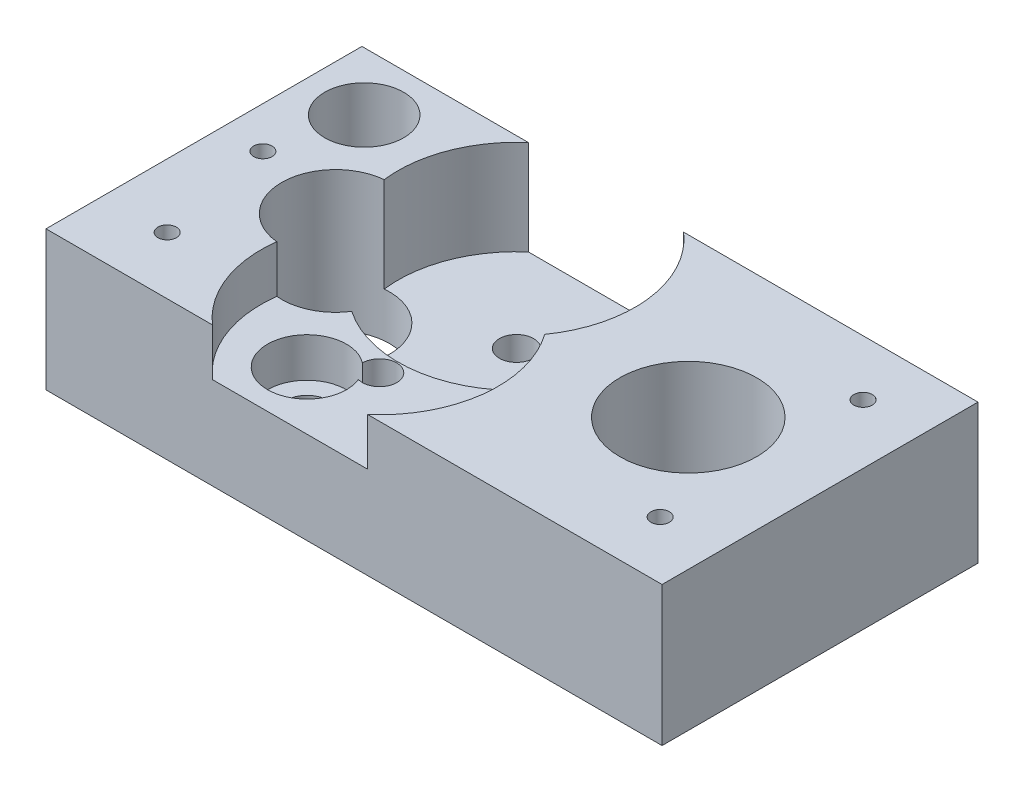
ISO-10303-21;
HEADER;
FILE_DESCRIPTION(('STEP AP214'),'2;1');
FILE_NAME('part.step','',(''),(''),'','','');
FILE_SCHEMA(('AUTOMOTIVE_DESIGN { 1 0 10303 214 1 1 1 1 }'));
ENDSEC;
DATA;
#1=APPLICATION_CONTEXT('core data for automotive mechanical design processes');
#2=APPLICATION_PROTOCOL_DEFINITION('international standard','automotive_design',2000,#1);
#3=PRODUCT_CONTEXT('',#1,'mechanical');
#4=PRODUCT('Part','Part','',(#3));
#5=PRODUCT_RELATED_PRODUCT_CATEGORY('part','',(#4));
#6=PRODUCT_DEFINITION_FORMATION('','',#4);
#7=PRODUCT_DEFINITION_CONTEXT('part definition',#1,'design');
#8=PRODUCT_DEFINITION('design','',#6,#7);
#9=PRODUCT_DEFINITION_SHAPE('','',#8);
#10=(LENGTH_UNIT() NAMED_UNIT(*) SI_UNIT(.MILLI.,.METRE.));
#11=(NAMED_UNIT(*) PLANE_ANGLE_UNIT() SI_UNIT($,.RADIAN.));
#12=(NAMED_UNIT(*) SI_UNIT($,.STERADIAN.) SOLID_ANGLE_UNIT());
#13=UNCERTAINTY_MEASURE_WITH_UNIT(LENGTH_MEASURE(1.E-05),#10,'distance_accuracy_value','');
#14=(GEOMETRIC_REPRESENTATION_CONTEXT(3) GLOBAL_UNCERTAINTY_ASSIGNED_CONTEXT((#13)) GLOBAL_UNIT_ASSIGNED_CONTEXT((#10,
#11,#12)) REPRESENTATION_CONTEXT('',''));
#15=CARTESIAN_POINT('',(0.,0.,0.));
#16=DIRECTION('',(0.,0.,1.));
#17=DIRECTION('',(1.,0.,0.));
#18=AXIS2_PLACEMENT_3D('',#15,#16,#17);
#19=CARTESIAN_POINT('',(2.3,0.,2.2141711607628));
#20=DIRECTION('',(0.,1.,0.));
#21=DIRECTION('',(0.,0.,1.));
#22=AXIS2_PLACEMENT_3D('',#19,#20,#21);
#23=CYLINDRICAL_SURFACE('',#22,0.8);
#24=CARTESIAN_POINT('',(2.3,0.,2.2141711607628));
#25=DIRECTION('',(0.,1.,0.));
#26=DIRECTION('',(0.,0.,1.));
#27=AXIS2_PLACEMENT_3D('',#24,#25,#26);
#28=CIRCLE('',#27,0.8);
#29=CARTESIAN_POINT('',(2.3,0.,3.0141711607628));
#30=VERTEX_POINT('',#29);
#31=EDGE_CURVE('E306',#30,#30,#28,.T.);
#32=ORIENTED_EDGE('',*,*,#31,.F.);
#33=EDGE_LOOP('',(#32));
#34=FACE_BOUND('',#33,.T.);
#35=CARTESIAN_POINT('',(2.3,2.,2.2141711607628));
#36=DIRECTION('',(0.,1.,0.));
#37=DIRECTION('',(0.,0.,1.));
#38=AXIS2_PLACEMENT_3D('',#35,#36,#37);
#39=CIRCLE('',#38,0.8);
#40=CARTESIAN_POINT('',(2.3,2.,3.0141711607628));
#41=VERTEX_POINT('',#40);
#42=EDGE_CURVE('E222',#41,#41,#39,.F.);
#43=ORIENTED_EDGE('',*,*,#42,.F.);
#44=EDGE_LOOP('',(#43));
#45=FACE_BOUND('',#44,.T.);
#46=ADVANCED_FACE('F117',(#34,#45),#23,.F.);
#47=CARTESIAN_POINT('',(7.7,0.,9.78582883923719));
#48=DIRECTION('',(0.,1.,0.));
#49=DIRECTION('',(0.,0.,1.));
#50=AXIS2_PLACEMENT_3D('',#47,#48,#49);
#51=CYLINDRICAL_SURFACE('',#50,0.800000000000001);
#52=CARTESIAN_POINT('',(7.7,0.,9.78582883923719));
#53=DIRECTION('',(0.,1.,0.));
#54=DIRECTION('',(0.,0.,1.));
#55=AXIS2_PLACEMENT_3D('',#52,#53,#54);
#56=CIRCLE('',#55,0.800000000000001);
#57=CARTESIAN_POINT('',(7.7,0.,10.5858288392372));
#58=VERTEX_POINT('',#57);
#59=EDGE_CURVE('E309',#58,#58,#56,.T.);
#60=ORIENTED_EDGE('',*,*,#59,.F.);
#61=EDGE_LOOP('',(#60));
#62=FACE_BOUND('',#61,.T.);
#63=CARTESIAN_POINT('',(7.7,2.,9.78582883923719));
#64=DIRECTION('',(0.,1.,0.));
#65=DIRECTION('',(0.,0.,1.));
#66=AXIS2_PLACEMENT_3D('',#63,#64,#65);
#67=CIRCLE('',#66,0.800000000000001);
#68=CARTESIAN_POINT('',(7.7,2.,10.5858288392372));
#69=VERTEX_POINT('',#68);
#70=EDGE_CURVE('E223',#69,#69,#67,.F.);
#71=ORIENTED_EDGE('',*,*,#70,.F.);
#72=EDGE_LOOP('',(#71));
#73=FACE_BOUND('',#72,.T.);
#74=ADVANCED_FACE('F429',(#62,#73),#51,.F.);
#75=CARTESIAN_POINT('',(0.,3.5,0.));
#76=DIRECTION('',(0.,1.,0.));
#77=DIRECTION('',(0.,0.,1.));
#78=AXIS2_PLACEMENT_3D('',#75,#76,#77);
#79=PLANE('',#78);
#80=CARTESIAN_POINT('',(7.7,3.5,9.78582883923719));
#81=DIRECTION('',(0.,1.,0.));
#82=DIRECTION('',(0.,0.,1.));
#83=AXIS2_PLACEMENT_3D('',#80,#81,#82);
#84=CIRCLE('',#83,1.5);
#85=CARTESIAN_POINT('',(8.62083363081924,3.5,8.601740403202));
#86=VERTEX_POINT('',#85);
#87=CARTESIAN_POINT('',(9.09107040473818,3.5,9.2246487174745));
#88=VERTEX_POINT('',#87);
#89=EDGE_CURVE('E303',#86,#88,#84,.T.);
#90=ORIENTED_EDGE('',*,*,#89,.F.);
#91=CARTESIAN_POINT('',(9.27083130081252,3.5,8.6));
#92=DIRECTION('',(0.,1.,0.));
#93=DIRECTION('',(0.,0.,1.));
#94=AXIS2_PLACEMENT_3D('',#91,#92,#93);
#95=CIRCLE('',#94,0.649999999999999);
#96=EDGE_CURVE('E234',#86,#88,#95,.F.);
#97=ORIENTED_EDGE('',*,*,#96,.T.);
#98=EDGE_LOOP('',(#90,#97));
#99=FACE_BOUND('',#98,.T.);
#100=CARTESIAN_POINT('',(9.27083130081252,3.5,8.6));
#101=DIRECTION('',(0.,1.,0.));
#102=DIRECTION('',(0.,0.,1.));
#103=AXIS2_PLACEMENT_3D('',#100,#101,#102);
#104=CIRCLE('',#103,4.5);
#105=CARTESIAN_POINT('',(12.2187118954093,3.5,12.));
#106=VERTEX_POINT('',#105);
#107=CARTESIAN_POINT('',(12.9437048352539,3.5,6.));
#108=VERTEX_POINT('',#107);
#109=EDGE_CURVE('E318',#106,#108,#104,.T.);
#110=ORIENTED_EDGE('',*,*,#109,.T.);
#111=CARTESIAN_POINT('',(9.27083130081252,3.5,3.4));
#112=DIRECTION('',(0.,1.,0.));
#113=DIRECTION('',(0.,0.,1.));
#114=AXIS2_PLACEMENT_3D('',#111,#112,#113);
#115=CIRCLE('',#114,4.5);
#116=CARTESIAN_POINT('',(6.72366983064256,3.5,7.10971271729788));
#117=VERTEX_POINT('',#116);
#118=EDGE_CURVE('E242',#117,#108,#115,.T.);
#119=ORIENTED_EDGE('',*,*,#118,.F.);
#120=CARTESIAN_POINT('',(5.,3.5,6.));
#121=DIRECTION('',(0.,1.,0.));
#122=DIRECTION('',(0.,0.,1.));
#123=AXIS2_PLACEMENT_3D('',#120,#121,#122);
#124=CIRCLE('',#123,2.05);
#125=CARTESIAN_POINT('',(4.8057148581784,3.5,8.04077271729788));
#126=VERTEX_POINT('',#125);
#127=EDGE_CURVE('E237',#117,#126,#124,.F.);
#128=ORIENTED_EDGE('',*,*,#127,.T.);
#129=CARTESIAN_POINT('',(9.27083130081252,3.5,8.6));
#130=DIRECTION('',(0.,1.,0.));
#131=DIRECTION('',(0.,0.,1.));
#132=AXIS2_PLACEMENT_3D('',#129,#130,#131);
#133=CIRCLE('',#132,4.5);
#134=CARTESIAN_POINT('',(6.32295070621578,3.5,12.));
#135=VERTEX_POINT('',#134);
#136=EDGE_CURVE('E339',#126,#135,#133,.T.);
#137=ORIENTED_EDGE('',*,*,#136,.T.);
#138=DIRECTION('',(1.,0.,0.));
#139=VECTOR('',#138,1.);
#140=CARTESIAN_POINT('',(0.,3.5,12.));
#141=LINE('',#140,#139);
#142=EDGE_CURVE('E251',#135,#106,#141,.T.);
#143=ORIENTED_EDGE('',*,*,#142,.T.);
#144=EDGE_LOOP('',(#110,#119,#128,#137,#143));
#145=FACE_BOUND('',#144,.T.);
#146=ADVANCED_FACE('F370',(#99,#145),#79,.T.);
#147=CARTESIAN_POINT('',(0.,1.7,0.));
#148=DIRECTION('',(0.,1.,0.));
#149=DIRECTION('',(0.,0.,1.));
#150=AXIS2_PLACEMENT_3D('',#147,#148,#149);
#151=PLANE('',#150);
#152=CARTESIAN_POINT('',(9.27083130081252,1.7,3.4));
#153=DIRECTION('',(0.,1.,0.));
#154=DIRECTION('',(0.,0.,1.));
#155=AXIS2_PLACEMENT_3D('',#152,#153,#154);
#156=CIRCLE('',#155,0.649999999999999);
#157=CARTESIAN_POINT('',(9.27083130081252,1.7,4.05));
#158=VERTEX_POINT('',#157);
#159=EDGE_CURVE('E259',#158,#158,#156,.T.);
#160=ORIENTED_EDGE('',*,*,#159,.F.);
#161=EDGE_LOOP('',(#160));
#162=FACE_BOUND('',#161,.T.);
#163=DIRECTION('',(1.,0.,0.));
#164=VECTOR('',#163,1.);
#165=CARTESIAN_POINT('',(0.,1.7,0.));
#166=LINE('',#165,#164);
#167=CARTESIAN_POINT('',(6.32295070621578,1.7,0.));
#168=VERTEX_POINT('',#167);
#169=CARTESIAN_POINT('',(12.2187118954093,1.7,0.));
#170=VERTEX_POINT('',#169);
#171=EDGE_CURVE('E277',#168,#170,#166,.T.);
#172=ORIENTED_EDGE('',*,*,#171,.F.);
#173=CARTESIAN_POINT('',(9.27083130081252,1.7,3.4));
#174=DIRECTION('',(0.,1.,0.));
#175=DIRECTION('',(0.,0.,1.));
#176=AXIS2_PLACEMENT_3D('',#173,#174,#175);
#177=CIRCLE('',#176,4.5);
#178=CARTESIAN_POINT('',(4.8057148581784,1.7,3.95922728270212));
#179=VERTEX_POINT('',#178);
#180=EDGE_CURVE('E249',#168,#179,#177,.T.);
#181=ORIENTED_EDGE('',*,*,#180,.T.);
#182=CARTESIAN_POINT('',(5.,1.7,6.));
#183=DIRECTION('',(0.,1.,0.));
#184=DIRECTION('',(0.,0.,1.));
#185=AXIS2_PLACEMENT_3D('',#182,#183,#184);
#186=CIRCLE('',#185,2.05);
#187=CARTESIAN_POINT('',(6.72366983064256,1.7,7.10971271729788));
#188=VERTEX_POINT('',#187);
#189=EDGE_CURVE('E271',#188,#179,#186,.T.);
#190=ORIENTED_EDGE('',*,*,#189,.F.);
#191=CARTESIAN_POINT('',(9.27083130081252,1.7,3.4));
#192=DIRECTION('',(0.,1.,0.));
#193=DIRECTION('',(0.,0.,1.));
#194=AXIS2_PLACEMENT_3D('',#191,#192,#193);
#195=CIRCLE('',#194,4.5);
#196=EDGE_CURVE('E246',#188,#170,#195,.T.);
#197=ORIENTED_EDGE('',*,*,#196,.T.);
#198=EDGE_LOOP('',(#172,#181,#190,#197));
#199=FACE_BOUND('',#198,.T.);
#200=ADVANCED_FACE('F387',(#162,#199),#151,.T.);
#201=CARTESIAN_POINT('',(0.,0.,0.));
#202=DIRECTION('',(0.,1.,0.));
#203=DIRECTION('',(0.,0.,1.));
#204=AXIS2_PLACEMENT_3D('',#201,#202,#203);
#205=PLANE('',#204);
#206=ORIENTED_EDGE('',*,*,#59,.T.);
#207=EDGE_LOOP('',(#206));
#208=FACE_BOUND('',#207,.T.);
#209=ORIENTED_EDGE('',*,*,#31,.T.);
#210=EDGE_LOOP('',(#209));
#211=FACE_BOUND('',#210,.T.);
#212=DIRECTION('',(0.,0.,1.));
#213=VECTOR('',#212,1.);
#214=CARTESIAN_POINT('',(0.,0.,0.));
#215=LINE('',#214,#213);
#216=CARTESIAN_POINT('',(0.,0.,0.));
#217=VERTEX_POINT('',#216);
#218=CARTESIAN_POINT('',(0.,0.,12.));
#219=VERTEX_POINT('',#218);
#220=EDGE_CURVE('E274',#217,#219,#215,.T.);
#221=ORIENTED_EDGE('',*,*,#220,.F.);
#222=DIRECTION('',(1.,0.,0.));
#223=VECTOR('',#222,1.);
#224=CARTESIAN_POINT('',(0.,0.,0.));
#225=LINE('',#224,#223);
#226=CARTESIAN_POINT('',(23.4,0.,0.));
#227=VERTEX_POINT('',#226);
#228=EDGE_CURVE('E281',#217,#227,#225,.T.);
#229=ORIENTED_EDGE('',*,*,#228,.T.);
#230=DIRECTION('',(0.,0.,1.));
#231=VECTOR('',#230,1.);
#232=CARTESIAN_POINT('',(23.4,0.,0.));
#233=LINE('',#232,#231);
#234=CARTESIAN_POINT('',(23.4,0.,12.));
#235=VERTEX_POINT('',#234);
#236=EDGE_CURVE('E287',#227,#235,#233,.T.);
#237=ORIENTED_EDGE('',*,*,#236,.T.);
#238=DIRECTION('',(1.,0.,0.));
#239=VECTOR('',#238,1.);
#240=CARTESIAN_POINT('',(0.,0.,12.));
#241=LINE('',#240,#239);
#242=EDGE_CURVE('E284',#219,#235,#241,.T.);
#243=ORIENTED_EDGE('',*,*,#242,.F.);
#244=EDGE_LOOP('',(#221,#229,#237,#243));
#245=FACE_BOUND('',#244,.T.);
#246=CARTESIAN_POINT('',(5.,0.,6.));
#247=DIRECTION('',(0.,1.,0.));
#248=DIRECTION('',(0.,0.,1.));
#249=AXIS2_PLACEMENT_3D('',#246,#247,#248);
#250=CIRCLE('',#249,2.05);
#251=CARTESIAN_POINT('',(5.,0.,8.05));
#252=VERTEX_POINT('',#251);
#253=EDGE_CURVE('E270',#252,#252,#250,.T.);
#254=ORIENTED_EDGE('',*,*,#253,.T.);
#255=EDGE_LOOP('',(#254));
#256=FACE_BOUND('',#255,.T.);
#257=CARTESIAN_POINT('',(9.27083130081252,0.,8.6));
#258=DIRECTION('',(0.,1.,0.));
#259=DIRECTION('',(0.,0.,1.));
#260=AXIS2_PLACEMENT_3D('',#257,#258,#259);
#261=CIRCLE('',#260,0.649999999999999);
#262=CARTESIAN_POINT('',(9.27083130081252,0.,9.25));
#263=VERTEX_POINT('',#262);
#264=EDGE_CURVE('E267',#263,#263,#261,.T.);
#265=ORIENTED_EDGE('',*,*,#264,.T.);
#266=EDGE_LOOP('',(#265));
#267=FACE_BOUND('',#266,.T.);
#268=CARTESIAN_POINT('',(18.3957400587213,0.,6.));
#269=DIRECTION('',(0.,1.,0.));
#270=DIRECTION('',(0.,0.,1.));
#271=AXIS2_PLACEMENT_3D('',#268,#269,#270);
#272=CIRCLE('',#271,2.6);
#273=CARTESIAN_POINT('',(18.3957400587213,0.,8.6));
#274=VERTEX_POINT('',#273);
#275=EDGE_CURVE('E262',#274,#274,#272,.T.);
#276=ORIENTED_EDGE('',*,*,#275,.T.);
#277=EDGE_LOOP('',(#276));
#278=FACE_BOUND('',#277,.T.);
#279=CARTESIAN_POINT('',(9.27083130081252,0.,3.4));
#280=DIRECTION('',(0.,1.,0.));
#281=DIRECTION('',(0.,0.,1.));
#282=AXIS2_PLACEMENT_3D('',#279,#280,#281);
#283=CIRCLE('',#282,0.649999999999999);
#284=CARTESIAN_POINT('',(9.27083130081252,0.,4.05));
#285=VERTEX_POINT('',#284);
#286=EDGE_CURVE('E258',#285,#285,#283,.T.);
#287=ORIENTED_EDGE('',*,*,#286,.T.);
#288=EDGE_LOOP('',(#287));
#289=FACE_BOUND('',#288,.T.);
#290=ADVANCED_FACE('F409',(#208,#211,#245,#256,#267,#278,#289),#205,.F.);
#291=CARTESIAN_POINT('',(0.,1.7,0.));
#292=DIRECTION('',(1.,0.,0.));
#293=DIRECTION('',(0.,0.,-1.));
#294=AXIS2_PLACEMENT_3D('',#291,#292,#293);
#295=PLANE('',#294);
#296=ORIENTED_EDGE('',*,*,#220,.T.);
#297=DIRECTION('',(0.,-1.,0.));
#298=VECTOR('',#297,1.);
#299=CARTESIAN_POINT('',(0.,1.7,12.));
#300=LINE('',#299,#298);
#301=CARTESIAN_POINT('',(0.,5.3,12.));
#302=VERTEX_POINT('',#301);
#303=EDGE_CURVE('E297',#302,#219,#300,.T.);
#304=ORIENTED_EDGE('',*,*,#303,.F.);
#305=DIRECTION('',(0.,0.,-1.));
#306=VECTOR('',#305,1.);
#307=CARTESIAN_POINT('',(0.,5.3,0.));
#308=LINE('',#307,#306);
#309=CARTESIAN_POINT('',(0.,5.3,0.));
#310=VERTEX_POINT('',#309);
#311=EDGE_CURVE('E349',#302,#310,#308,.T.);
#312=ORIENTED_EDGE('',*,*,#311,.T.);
#313=DIRECTION('',(0.,-1.,0.));
#314=VECTOR('',#313,1.);
#315=CARTESIAN_POINT('',(0.,1.7,0.));
#316=LINE('',#315,#314);
#317=EDGE_CURVE('E280',#310,#217,#316,.T.);
#318=ORIENTED_EDGE('',*,*,#317,.T.);
#319=EDGE_LOOP('',(#296,#304,#312,#318));
#320=FACE_BOUND('',#319,.T.);
#321=ADVANCED_FACE('F119',(#320),#295,.F.);
#322=CARTESIAN_POINT('',(0.,1.7,12.));
#323=DIRECTION('',(0.,0.,-1.));
#324=DIRECTION('',(-1.,0.,0.));
#325=AXIS2_PLACEMENT_3D('',#322,#323,#324);
#326=PLANE('',#325);
#327=ORIENTED_EDGE('',*,*,#242,.T.);
#328=DIRECTION('',(0.,-1.,0.));
#329=VECTOR('',#328,1.);
#330=CARTESIAN_POINT('',(23.4,1.7,12.));
#331=LINE('',#330,#329);
#332=CARTESIAN_POINT('',(23.4,5.3,12.));
#333=VERTEX_POINT('',#332);
#334=EDGE_CURVE('E295',#333,#235,#331,.T.);
#335=ORIENTED_EDGE('',*,*,#334,.F.);
#336=DIRECTION('',(-1.,0.,0.));
#337=VECTOR('',#336,1.);
#338=CARTESIAN_POINT('',(0.,5.3,12.));
#339=LINE('',#338,#337);
#340=CARTESIAN_POINT('',(12.2187118954093,5.3,12.));
#341=VERTEX_POINT('',#340);
#342=EDGE_CURVE('E325',#333,#341,#339,.T.);
#343=ORIENTED_EDGE('',*,*,#342,.T.);
#344=DIRECTION('',(0.,-1.,0.));
#345=VECTOR('',#344,1.);
#346=CARTESIAN_POINT('',(12.2187118954093,5.3,12.));
#347=LINE('',#346,#345);
#348=EDGE_CURVE('E334',#341,#106,#347,.T.);
#349=ORIENTED_EDGE('',*,*,#348,.T.);
#350=ORIENTED_EDGE('',*,*,#142,.F.);
#351=DIRECTION('',(0.,-1.,0.));
#352=VECTOR('',#351,1.);
#353=CARTESIAN_POINT('',(6.32295070621578,5.3,12.));
#354=LINE('',#353,#352);
#355=CARTESIAN_POINT('',(6.32295070621578,5.3,12.));
#356=VERTEX_POINT('',#355);
#357=EDGE_CURVE('E139',#356,#135,#354,.T.);
#358=ORIENTED_EDGE('',*,*,#357,.F.);
#359=DIRECTION('',(-1.,0.,0.));
#360=VECTOR('',#359,1.);
#361=CARTESIAN_POINT('',(0.,5.3,12.));
#362=LINE('',#361,#360);
#363=EDGE_CURVE('E346',#356,#302,#362,.T.);
#364=ORIENTED_EDGE('',*,*,#363,.T.);
#365=ORIENTED_EDGE('',*,*,#303,.T.);
#366=EDGE_LOOP('',(#327,#335,#343,#349,#350,#358,#364,#365));
#367=FACE_BOUND('',#366,.T.);
#368=ADVANCED_FACE('F402',(#367),#326,.F.);
#369=CARTESIAN_POINT('',(23.4,1.7,0.));
#370=DIRECTION('',(1.,0.,0.));
#371=DIRECTION('',(0.,0.,-1.));
#372=AXIS2_PLACEMENT_3D('',#369,#370,#371);
#373=PLANE('',#372);
#374=ORIENTED_EDGE('',*,*,#236,.F.);
#375=DIRECTION('',(0.,-1.,0.));
#376=VECTOR('',#375,1.);
#377=CARTESIAN_POINT('',(23.4,1.7,0.));
#378=LINE('',#377,#376);
#379=CARTESIAN_POINT('',(23.4,5.3,0.));
#380=VERTEX_POINT('',#379);
#381=EDGE_CURVE('E293',#380,#227,#378,.T.);
#382=ORIENTED_EDGE('',*,*,#381,.F.);
#383=DIRECTION('',(0.,0.,1.));
#384=VECTOR('',#383,1.);
#385=CARTESIAN_POINT('',(23.4,5.3,0.));
#386=LINE('',#385,#384);
#387=EDGE_CURVE('E322',#380,#333,#386,.T.);
#388=ORIENTED_EDGE('',*,*,#387,.T.);
#389=ORIENTED_EDGE('',*,*,#334,.T.);
#390=EDGE_LOOP('',(#374,#382,#388,#389));
#391=FACE_BOUND('',#390,.T.);
#392=ADVANCED_FACE('F406',(#391),#373,.T.);
#393=CARTESIAN_POINT('',(0.,1.7,0.));
#394=DIRECTION('',(0.,0.,-1.));
#395=DIRECTION('',(-1.,0.,0.));
#396=AXIS2_PLACEMENT_3D('',#393,#394,#395);
#397=PLANE('',#396);
#398=ORIENTED_EDGE('',*,*,#228,.F.);
#399=ORIENTED_EDGE('',*,*,#317,.F.);
#400=DIRECTION('',(1.,0.,0.));
#401=VECTOR('',#400,1.);
#402=CARTESIAN_POINT('',(0.,5.3,0.));
#403=LINE('',#402,#401);
#404=CARTESIAN_POINT('',(6.32295070621578,5.3,0.));
#405=VERTEX_POINT('',#404);
#406=EDGE_CURVE('E352',#310,#405,#403,.T.);
#407=ORIENTED_EDGE('',*,*,#406,.T.);
#408=DIRECTION('',(0.,-1.,0.));
#409=VECTOR('',#408,1.);
#410=CARTESIAN_POINT('',(6.32295070621578,3.5,0.));
#411=LINE('',#410,#409);
#412=EDGE_CURVE('E236',#405,#168,#411,.T.);
#413=ORIENTED_EDGE('',*,*,#412,.T.);
#414=ORIENTED_EDGE('',*,*,#171,.T.);
#415=DIRECTION('',(0.,-1.,0.));
#416=VECTOR('',#415,1.);
#417=CARTESIAN_POINT('',(12.2187118954093,3.5,0.));
#418=LINE('',#417,#416);
#419=CARTESIAN_POINT('',(12.2187118954093,5.3,0.));
#420=VERTEX_POINT('',#419);
#421=EDGE_CURVE('E256',#420,#170,#418,.T.);
#422=ORIENTED_EDGE('',*,*,#421,.F.);
#423=DIRECTION('',(1.,0.,0.));
#424=VECTOR('',#423,1.);
#425=CARTESIAN_POINT('',(0.,5.3,0.));
#426=LINE('',#425,#424);
#427=EDGE_CURVE('E319',#420,#380,#426,.T.);
#428=ORIENTED_EDGE('',*,*,#427,.T.);
#429=ORIENTED_EDGE('',*,*,#381,.T.);
#430=EDGE_LOOP('',(#398,#399,#407,#413,#414,#422,#428,#429));
#431=FACE_BOUND('',#430,.T.);
#432=ADVANCED_FACE('F389',(#431),#397,.T.);
#433=CARTESIAN_POINT('',(5.,1.7,6.));
#434=DIRECTION('',(0.,-1.,0.));
#435=DIRECTION('',(0.,0.,-1.));
#436=AXIS2_PLACEMENT_3D('',#433,#434,#435);
#437=CYLINDRICAL_SURFACE('',#436,2.05);
#438=ORIENTED_EDGE('',*,*,#189,.T.);
#439=DIRECTION('',(0.,-1.,0.));
#440=VECTOR('',#439,1.);
#441=CARTESIAN_POINT('',(4.8057148581784,3.5,3.95922728270212));
#442=LINE('',#441,#440);
#443=CARTESIAN_POINT('',(4.8057148581784,5.3,3.95922728270212));
#444=VERTEX_POINT('',#443);
#445=EDGE_CURVE('E239',#444,#179,#442,.T.);
#446=ORIENTED_EDGE('',*,*,#445,.F.);
#447=CARTESIAN_POINT('',(5.,5.3,6.));
#448=DIRECTION('',(0.,1.,0.));
#449=DIRECTION('',(0.,0.,1.));
#450=AXIS2_PLACEMENT_3D('',#447,#448,#449);
#451=CIRCLE('',#450,2.05);
#452=CARTESIAN_POINT('',(4.8057148581784,5.3,8.04077271729788));
#453=VERTEX_POINT('',#452);
#454=EDGE_CURVE('E341',#444,#453,#451,.T.);
#455=ORIENTED_EDGE('',*,*,#454,.T.);
#456=DIRECTION('',(0.,-1.,0.));
#457=VECTOR('',#456,1.);
#458=CARTESIAN_POINT('',(4.8057148581784,5.3,8.04077271729788));
#459=LINE('',#458,#457);
#460=EDGE_CURVE('E358',#453,#126,#459,.T.);
#461=ORIENTED_EDGE('',*,*,#460,.T.);
#462=ORIENTED_EDGE('',*,*,#127,.F.);
#463=DIRECTION('',(0.,-1.,0.));
#464=VECTOR('',#463,1.);
#465=CARTESIAN_POINT('',(6.72366983064256,3.5,7.10971271729788));
#466=LINE('',#465,#464);
#467=EDGE_CURVE('E254',#117,#188,#466,.T.);
#468=ORIENTED_EDGE('',*,*,#467,.T.);
#469=EDGE_LOOP('',(#438,#446,#455,#461,#462,#468));
#470=FACE_BOUND('',#469,.T.);
#471=ORIENTED_EDGE('',*,*,#253,.F.);
#472=EDGE_LOOP('',(#471));
#473=FACE_BOUND('',#472,.T.);
#474=ADVANCED_FACE('F396',(#470,#473),#437,.F.);
#475=CARTESIAN_POINT('',(9.27083130081252,1.7,8.6));
#476=DIRECTION('',(0.,-1.,0.));
#477=DIRECTION('',(0.,0.,-1.));
#478=AXIS2_PLACEMENT_3D('',#475,#476,#477);
#479=CYLINDRICAL_SURFACE('',#478,0.649999999999999);
#480=DIRECTION('',(0.,1.,0.));
#481=VECTOR('',#480,1.);
#482=CARTESIAN_POINT('',(8.62083363081924,3.65,8.601740403202));
#483=LINE('',#482,#481);
#484=CARTESIAN_POINT('',(8.62083363081924,2.,8.601740403202));
#485=VERTEX_POINT('',#484);
#486=EDGE_CURVE('E13',#485,#86,#483,.T.);
#487=ORIENTED_EDGE('',*,*,#486,.F.);
#488=CARTESIAN_POINT('',(9.27083130081252,2.,8.6));
#489=DIRECTION('',(0.,1.,0.));
#490=DIRECTION('',(0.,0.,1.));
#491=AXIS2_PLACEMENT_3D('',#488,#489,#490);
#492=CIRCLE('',#491,0.649999999999999);
#493=CARTESIAN_POINT('',(9.09107040473818,2.,9.22464871747451));
#494=VERTEX_POINT('',#493);
#495=EDGE_CURVE('E216',#485,#494,#492,.T.);
#496=ORIENTED_EDGE('',*,*,#495,.T.);
#497=DIRECTION('',(0.,1.,0.));
#498=VECTOR('',#497,1.);
#499=CARTESIAN_POINT('',(9.09107040473818,3.65,9.2246487174745));
#500=LINE('',#499,#498);
#501=EDGE_CURVE('E125',#88,#494,#500,.F.);
#502=ORIENTED_EDGE('',*,*,#501,.F.);
#503=ORIENTED_EDGE('',*,*,#96,.F.);
#504=EDGE_LOOP('',(#487,#496,#502,#503));
#505=FACE_BOUND('',#504,.T.);
#506=ORIENTED_EDGE('',*,*,#264,.F.);
#507=EDGE_LOOP('',(#506));
#508=FACE_BOUND('',#507,.T.);
#509=ADVANCED_FACE('F231',(#505,#508),#479,.F.);
#510=CARTESIAN_POINT('',(18.3957400587213,1.7,6.));
#511=DIRECTION('',(0.,-1.,0.));
#512=DIRECTION('',(0.,0.,-1.));
#513=AXIS2_PLACEMENT_3D('',#510,#511,#512);
#514=CYLINDRICAL_SURFACE('',#513,2.6);
#515=ORIENTED_EDGE('',*,*,#275,.F.);
#516=EDGE_LOOP('',(#515));
#517=FACE_BOUND('',#516,.T.);
#518=CARTESIAN_POINT('',(18.3957400587213,5.3,6.));
#519=DIRECTION('',(0.,1.,0.));
#520=DIRECTION('',(0.,0.,1.));
#521=AXIS2_PLACEMENT_3D('',#518,#519,#520);
#522=CIRCLE('',#521,2.6);
#523=CARTESIAN_POINT('',(18.3957400587213,5.3,8.6));
#524=VERTEX_POINT('',#523);
#525=EDGE_CURVE('E314',#524,#524,#522,.T.);
#526=ORIENTED_EDGE('',*,*,#525,.T.);
#527=EDGE_LOOP('',(#526));
#528=FACE_BOUND('',#527,.T.);
#529=ADVANCED_FACE('F584',(#517,#528),#514,.F.);
#530=CARTESIAN_POINT('',(9.27083130081252,1.7,3.4));
#531=DIRECTION('',(0.,-1.,0.));
#532=DIRECTION('',(0.,0.,-1.));
#533=AXIS2_PLACEMENT_3D('',#530,#531,#532);
#534=CYLINDRICAL_SURFACE('',#533,0.649999999999999);
#535=ORIENTED_EDGE('',*,*,#159,.T.);
#536=EDGE_LOOP('',(#535));
#537=FACE_BOUND('',#536,.T.);
#538=ORIENTED_EDGE('',*,*,#286,.F.);
#539=EDGE_LOOP('',(#538));
#540=FACE_BOUND('',#539,.T.);
#541=ADVANCED_FACE('F650',(#537,#540),#534,.F.);
#542=CARTESIAN_POINT('',(9.27083130081252,3.5,3.4));
#543=DIRECTION('',(0.,-1.,0.));
#544=DIRECTION('',(0.,0.,-1.));
#545=AXIS2_PLACEMENT_3D('',#542,#543,#544);
#546=CYLINDRICAL_SURFACE('',#545,4.5);
#547=ORIENTED_EDGE('',*,*,#196,.F.);
#548=ORIENTED_EDGE('',*,*,#467,.F.);
#549=ORIENTED_EDGE('',*,*,#118,.T.);
#550=DIRECTION('',(0.,-1.,0.));
#551=VECTOR('',#550,1.);
#552=CARTESIAN_POINT('',(12.9437048352539,5.3,6.));
#553=LINE('',#552,#551);
#554=CARTESIAN_POINT('',(12.9437048352539,5.3,6.));
#555=VERTEX_POINT('',#554);
#556=EDGE_CURVE('E337',#555,#108,#553,.T.);
#557=ORIENTED_EDGE('',*,*,#556,.F.);
#558=CARTESIAN_POINT('',(9.27083130081252,5.3,3.4));
#559=DIRECTION('',(0.,1.,0.));
#560=DIRECTION('',(0.,0.,1.));
#561=AXIS2_PLACEMENT_3D('',#558,#559,#560);
#562=CIRCLE('',#561,4.5);
#563=EDGE_CURVE('E331',#555,#420,#562,.T.);
#564=ORIENTED_EDGE('',*,*,#563,.T.);
#565=ORIENTED_EDGE('',*,*,#421,.T.);
#566=EDGE_LOOP('',(#547,#548,#549,#557,#564,#565));
#567=FACE_BOUND('',#566,.T.);
#568=ADVANCED_FACE('F367',(#567),#546,.F.);
#569=CARTESIAN_POINT('',(9.27083130081252,3.5,3.4));
#570=DIRECTION('',(0.,-1.,0.));
#571=DIRECTION('',(0.,0.,-1.));
#572=AXIS2_PLACEMENT_3D('',#569,#570,#571);
#573=CYLINDRICAL_SURFACE('',#572,4.5);
#574=ORIENTED_EDGE('',*,*,#180,.F.);
#575=ORIENTED_EDGE('',*,*,#412,.F.);
#576=CARTESIAN_POINT('',(9.27083130081252,5.3,3.4));
#577=DIRECTION('',(0.,1.,0.));
#578=DIRECTION('',(0.,0.,1.));
#579=AXIS2_PLACEMENT_3D('',#576,#577,#578);
#580=CIRCLE('',#579,4.5);
#581=EDGE_CURVE('E355',#405,#444,#580,.T.);
#582=ORIENTED_EDGE('',*,*,#581,.T.);
#583=ORIENTED_EDGE('',*,*,#445,.T.);
#584=EDGE_LOOP('',(#574,#575,#582,#583));
#585=FACE_BOUND('',#584,.T.);
#586=ADVANCED_FACE('F394',(#585),#573,.F.);
#587=CARTESIAN_POINT('',(9.27083130081252,5.3,8.6));
#588=DIRECTION('',(0.,-1.,0.));
#589=DIRECTION('',(0.,0.,-1.));
#590=AXIS2_PLACEMENT_3D('',#587,#588,#589);
#591=CYLINDRICAL_SURFACE('',#590,4.5);
#592=ORIENTED_EDGE('',*,*,#136,.F.);
#593=ORIENTED_EDGE('',*,*,#460,.F.);
#594=CARTESIAN_POINT('',(9.27083130081252,5.3,8.6));
#595=DIRECTION('',(0.,1.,0.));
#596=DIRECTION('',(0.,0.,1.));
#597=AXIS2_PLACEMENT_3D('',#594,#595,#596);
#598=CIRCLE('',#597,4.5);
#599=EDGE_CURVE('E344',#453,#356,#598,.T.);
#600=ORIENTED_EDGE('',*,*,#599,.T.);
#601=ORIENTED_EDGE('',*,*,#357,.T.);
#602=EDGE_LOOP('',(#592,#593,#600,#601));
#603=FACE_BOUND('',#602,.T.);
#604=ADVANCED_FACE('F400',(#603),#591,.F.);
#605=CARTESIAN_POINT('',(5.,5.3,6.));
#606=DIRECTION('',(0.,1.,0.));
#607=DIRECTION('',(0.,0.,1.));
#608=AXIS2_PLACEMENT_3D('',#605,#606,#607);
#609=PLANE('',#608);
#610=CARTESIAN_POINT('',(1.5689431846177,5.3,5.33248975391931));
#611=DIRECTION('',(0.,1.,0.));
#612=DIRECTION('',(0.,0.,1.));
#613=AXIS2_PLACEMENT_3D('',#610,#611,#612);
#614=CIRCLE('',#613,0.35);
#615=CARTESIAN_POINT('',(1.5689431846177,5.3,5.68248975391931));
#616=VERTEX_POINT('',#615);
#617=EDGE_CURVE('E468',#616,#616,#614,.T.);
#618=ORIENTED_EDGE('',*,*,#617,.F.);
#619=EDGE_LOOP('',(#618));
#620=FACE_BOUND('',#619,.T.);
#621=CARTESIAN_POINT('',(2.41918552162618,5.3,9.81751808163903));
#622=DIRECTION('',(0.,1.,0.));
#623=DIRECTION('',(0.,0.,1.));
#624=AXIS2_PLACEMENT_3D('',#621,#622,#623);
#625=CIRCLE('',#624,0.35);
#626=CARTESIAN_POINT('',(2.41918552162618,5.3,10.167518081639));
#627=VERTEX_POINT('',#626);
#628=EDGE_CURVE('E478',#627,#627,#625,.T.);
#629=ORIENTED_EDGE('',*,*,#628,.F.);
#630=EDGE_LOOP('',(#629));
#631=FACE_BOUND('',#630,.T.);
#632=CARTESIAN_POINT('',(2.3,5.3,2.2141711607628));
#633=DIRECTION('',(0.,1.,0.));
#634=DIRECTION('',(0.,0.,1.));
#635=AXIS2_PLACEMENT_3D('',#632,#633,#634);
#636=CIRCLE('',#635,1.5);
#637=CARTESIAN_POINT('',(2.3,5.3,3.7141711607628));
#638=VERTEX_POINT('',#637);
#639=EDGE_CURVE('E228',#638,#638,#636,.T.);
#640=ORIENTED_EDGE('',*,*,#639,.F.);
#641=EDGE_LOOP('',(#640));
#642=FACE_BOUND('',#641,.T.);
#643=ORIENTED_EDGE('',*,*,#454,.F.);
#644=ORIENTED_EDGE('',*,*,#581,.F.);
#645=ORIENTED_EDGE('',*,*,#406,.F.);
#646=ORIENTED_EDGE('',*,*,#311,.F.);
#647=ORIENTED_EDGE('',*,*,#363,.F.);
#648=ORIENTED_EDGE('',*,*,#599,.F.);
#649=EDGE_LOOP('',(#643,#644,#645,#646,#647,#648));
#650=FACE_BOUND('',#649,.T.);
#651=ADVANCED_FACE('F414',(#620,#631,#642,#650),#609,.T.);
#652=CARTESIAN_POINT('',(9.27083130081252,5.3,8.6));
#653=DIRECTION('',(0.,1.,0.));
#654=DIRECTION('',(0.,0.,1.));
#655=AXIS2_PLACEMENT_3D('',#652,#653,#654);
#656=PLANE('',#655);
#657=CARTESIAN_POINT('',(21.1431759936535,5.3,9.81751808163903));
#658=DIRECTION('',(0.,1.,0.));
#659=DIRECTION('',(0.,0.,1.));
#660=AXIS2_PLACEMENT_3D('',#657,#658,#659);
#661=CIRCLE('',#660,0.350000000000001);
#662=CARTESIAN_POINT('',(21.1431759936535,5.3,10.167518081639));
#663=VERTEX_POINT('',#662);
#664=EDGE_CURVE('E484',#663,#663,#661,.T.);
#665=ORIENTED_EDGE('',*,*,#664,.F.);
#666=EDGE_LOOP('',(#665));
#667=FACE_BOUND('',#666,.T.);
#668=CARTESIAN_POINT('',(21.1431759936535,5.3,2.10892517299398));
#669=DIRECTION('',(0.,1.,0.));
#670=DIRECTION('',(0.,0.,1.));
#671=AXIS2_PLACEMENT_3D('',#668,#669,#670);
#672=CIRCLE('',#671,0.350000000000001);
#673=CARTESIAN_POINT('',(21.1431759936535,5.3,2.45892517299398));
#674=VERTEX_POINT('',#673);
#675=EDGE_CURVE('E471',#674,#674,#672,.T.);
#676=ORIENTED_EDGE('',*,*,#675,.F.);
#677=EDGE_LOOP('',(#676));
#678=FACE_BOUND('',#677,.T.);
#679=ORIENTED_EDGE('',*,*,#427,.F.);
#680=ORIENTED_EDGE('',*,*,#563,.F.);
#681=CARTESIAN_POINT('',(9.27083130081252,5.3,8.6));
#682=DIRECTION('',(0.,1.,0.));
#683=DIRECTION('',(0.,0.,1.));
#684=AXIS2_PLACEMENT_3D('',#681,#682,#683);
#685=CIRCLE('',#684,4.5);
#686=EDGE_CURVE('E328',#341,#555,#685,.T.);
#687=ORIENTED_EDGE('',*,*,#686,.F.);
#688=ORIENTED_EDGE('',*,*,#342,.F.);
#689=ORIENTED_EDGE('',*,*,#387,.F.);
#690=EDGE_LOOP('',(#679,#680,#687,#688,#689));
#691=FACE_BOUND('',#690,.T.);
#692=ORIENTED_EDGE('',*,*,#525,.F.);
#693=EDGE_LOOP('',(#692));
#694=FACE_BOUND('',#693,.T.);
#695=ADVANCED_FACE('F380',(#667,#678,#691,#694),#656,.T.);
#696=CARTESIAN_POINT('',(9.27083130081252,5.3,8.6));
#697=DIRECTION('',(0.,-1.,0.));
#698=DIRECTION('',(0.,0.,-1.));
#699=AXIS2_PLACEMENT_3D('',#696,#697,#698);
#700=CYLINDRICAL_SURFACE('',#699,4.5);
#701=ORIENTED_EDGE('',*,*,#109,.F.);
#702=ORIENTED_EDGE('',*,*,#348,.F.);
#703=ORIENTED_EDGE('',*,*,#686,.T.);
#704=ORIENTED_EDGE('',*,*,#556,.T.);
#705=EDGE_LOOP('',(#701,#702,#703,#704));
#706=FACE_BOUND('',#705,.T.);
#707=ADVANCED_FACE('F374',(#706),#700,.F.);
#708=CARTESIAN_POINT('',(0.,2.,0.));
#709=DIRECTION('',(0.,1.,0.));
#710=DIRECTION('',(0.,0.,1.));
#711=AXIS2_PLACEMENT_3D('',#708,#709,#710);
#712=PLANE('',#711);
#713=CARTESIAN_POINT('',(7.7,2.,9.78582883923719));
#714=DIRECTION('',(0.,1.,0.));
#715=DIRECTION('',(0.,0.,1.));
#716=AXIS2_PLACEMENT_3D('',#713,#714,#715);
#717=CIRCLE('',#716,1.5);
#718=EDGE_CURVE('E131',#494,#485,#717,.F.);
#719=ORIENTED_EDGE('',*,*,#718,.F.);
#720=ORIENTED_EDGE('',*,*,#495,.F.);
#721=EDGE_LOOP('',(#719,#720));
#722=FACE_BOUND('',#721,.T.);
#723=ORIENTED_EDGE('',*,*,#70,.T.);
#724=EDGE_LOOP('',(#723));
#725=FACE_BOUND('',#724,.T.);
#726=ADVANCED_FACE('F217',(#722,#725),#712,.T.);
#727=CARTESIAN_POINT('',(7.7,-4.24264068711929,9.78582883923719));
#728=DIRECTION('',(0.,1.,0.));
#729=DIRECTION('',(0.,0.,1.));
#730=AXIS2_PLACEMENT_3D('',#727,#728,#729);
#731=CYLINDRICAL_SURFACE('',#730,1.5);
#732=ORIENTED_EDGE('',*,*,#486,.T.);
#733=ORIENTED_EDGE('',*,*,#89,.T.);
#734=ORIENTED_EDGE('',*,*,#501,.T.);
#735=ORIENTED_EDGE('',*,*,#718,.T.);
#736=EDGE_LOOP('',(#732,#733,#734,#735));
#737=FACE_BOUND('',#736,.T.);
#738=ADVANCED_FACE('F226',(#737),#731,.F.);
#739=CARTESIAN_POINT('',(0.,2.,0.));
#740=DIRECTION('',(0.,1.,0.));
#741=DIRECTION('',(0.,0.,1.));
#742=AXIS2_PLACEMENT_3D('',#739,#740,#741);
#743=PLANE('',#742);
#744=CARTESIAN_POINT('',(2.3,2.,2.2141711607628));
#745=DIRECTION('',(0.,1.,0.));
#746=DIRECTION('',(0.,0.,1.));
#747=AXIS2_PLACEMENT_3D('',#744,#745,#746);
#748=CIRCLE('',#747,1.5);
#749=CARTESIAN_POINT('',(2.3,2.,3.7141711607628));
#750=VERTEX_POINT('',#749);
#751=EDGE_CURVE('E463',#750,#750,#748,.F.);
#752=ORIENTED_EDGE('',*,*,#751,.F.);
#753=EDGE_LOOP('',(#752));
#754=FACE_BOUND('',#753,.T.);
#755=ORIENTED_EDGE('',*,*,#42,.T.);
#756=EDGE_LOOP('',(#755));
#757=FACE_BOUND('',#756,.T.);
#758=ADVANCED_FACE('F448',(#754,#757),#743,.T.);
#759=CARTESIAN_POINT('',(2.3,-4.24264068711929,2.2141711607628));
#760=DIRECTION('',(0.,1.,0.));
#761=DIRECTION('',(0.,0.,1.));
#762=AXIS2_PLACEMENT_3D('',#759,#760,#761);
#763=CYLINDRICAL_SURFACE('',#762,1.5);
#764=ORIENTED_EDGE('',*,*,#751,.T.);
#765=EDGE_LOOP('',(#764));
#766=FACE_BOUND('',#765,.T.);
#767=ORIENTED_EDGE('',*,*,#639,.T.);
#768=EDGE_LOOP('',(#767));
#769=FACE_BOUND('',#768,.T.);
#770=ADVANCED_FACE('F454',(#766,#769),#763,.F.);
#771=CARTESIAN_POINT('',(21.1431759936535,3.3,2.10892517299398));
#772=DIRECTION('',(0.,1.,0.));
#773=DIRECTION('',(0.,0.,1.));
#774=AXIS2_PLACEMENT_3D('',#771,#772,#773);
#775=CYLINDRICAL_SURFACE('',#774,0.350000000000001);
#776=CARTESIAN_POINT('',(21.1431759936535,3.3,2.10892517299398));
#777=DIRECTION('',(0.,1.,0.));
#778=DIRECTION('',(0.,0.,1.));
#779=AXIS2_PLACEMENT_3D('',#776,#777,#778);
#780=CIRCLE('',#779,0.350000000000001);
#781=CARTESIAN_POINT('',(21.1431759936535,3.3,2.45892517299398));
#782=VERTEX_POINT('',#781);
#783=EDGE_CURVE('E474',#782,#782,#780,.T.);
#784=ORIENTED_EDGE('',*,*,#783,.F.);
#785=EDGE_LOOP('',(#784));
#786=FACE_BOUND('',#785,.T.);
#787=ORIENTED_EDGE('',*,*,#675,.T.);
#788=EDGE_LOOP('',(#787));
#789=FACE_BOUND('',#788,.T.);
#790=ADVANCED_FACE('F451',(#786,#789),#775,.F.);
#791=CARTESIAN_POINT('',(21.1431759936535,3.3,2.10892517299398));
#792=DIRECTION('',(0.,1.,0.));
#793=DIRECTION('',(0.,0.,1.));
#794=AXIS2_PLACEMENT_3D('',#791,#792,#793);
#795=PLANE('',#794);
#796=ORIENTED_EDGE('',*,*,#783,.T.);
#797=EDGE_LOOP('',(#796));
#798=FACE_BOUND('',#797,.T.);
#799=ADVANCED_FACE('F514',(#798),#795,.T.);
#800=CARTESIAN_POINT('',(21.1431759936535,3.3,9.81751808163903));
#801=DIRECTION('',(0.,1.,0.));
#802=DIRECTION('',(0.,0.,1.));
#803=AXIS2_PLACEMENT_3D('',#800,#801,#802);
#804=CYLINDRICAL_SURFACE('',#803,0.350000000000001);
#805=CARTESIAN_POINT('',(21.1431759936535,3.3,9.81751808163903));
#806=DIRECTION('',(0.,1.,0.));
#807=DIRECTION('',(0.,0.,1.));
#808=AXIS2_PLACEMENT_3D('',#805,#806,#807);
#809=CIRCLE('',#808,0.350000000000001);
#810=CARTESIAN_POINT('',(21.1431759936535,3.3,10.167518081639));
#811=VERTEX_POINT('',#810);
#812=EDGE_CURVE('E475',#811,#811,#809,.T.);
#813=ORIENTED_EDGE('',*,*,#812,.F.);
#814=EDGE_LOOP('',(#813));
#815=FACE_BOUND('',#814,.T.);
#816=ORIENTED_EDGE('',*,*,#664,.T.);
#817=EDGE_LOOP('',(#816));
#818=FACE_BOUND('',#817,.T.);
#819=ADVANCED_FACE('F511',(#815,#818),#804,.F.);
#820=CARTESIAN_POINT('',(21.1431759936535,3.3,9.81751808163903));
#821=DIRECTION('',(0.,1.,0.));
#822=DIRECTION('',(0.,0.,1.));
#823=AXIS2_PLACEMENT_3D('',#820,#821,#822);
#824=PLANE('',#823);
#825=ORIENTED_EDGE('',*,*,#812,.T.);
#826=EDGE_LOOP('',(#825));
#827=FACE_BOUND('',#826,.T.);
#828=ADVANCED_FACE('F508',(#827),#824,.T.);
#829=CARTESIAN_POINT('',(2.41918552162618,3.3,9.81751808163903));
#830=DIRECTION('',(0.,1.,0.));
#831=DIRECTION('',(0.,0.,1.));
#832=AXIS2_PLACEMENT_3D('',#829,#830,#831);
#833=CYLINDRICAL_SURFACE('',#832,0.35);
#834=CARTESIAN_POINT('',(2.41918552162618,3.3,9.81751808163903));
#835=DIRECTION('',(0.,1.,0.));
#836=DIRECTION('',(0.,0.,1.));
#837=AXIS2_PLACEMENT_3D('',#834,#835,#836);
#838=CIRCLE('',#837,0.35);
#839=CARTESIAN_POINT('',(2.41918552162618,3.3,10.167518081639));
#840=VERTEX_POINT('',#839);
#841=EDGE_CURVE('E481',#840,#840,#838,.T.);
#842=ORIENTED_EDGE('',*,*,#841,.F.);
#843=EDGE_LOOP('',(#842));
#844=FACE_BOUND('',#843,.T.);
#845=ORIENTED_EDGE('',*,*,#628,.T.);
#846=EDGE_LOOP('',(#845));
#847=FACE_BOUND('',#846,.T.);
#848=ADVANCED_FACE('F503',(#844,#847),#833,.F.);
#849=CARTESIAN_POINT('',(2.41918552162618,3.3,9.81751808163903));
#850=DIRECTION('',(0.,1.,0.));
#851=DIRECTION('',(0.,0.,1.));
#852=AXIS2_PLACEMENT_3D('',#849,#850,#851);
#853=PLANE('',#852);
#854=ORIENTED_EDGE('',*,*,#841,.T.);
#855=EDGE_LOOP('',(#854));
#856=FACE_BOUND('',#855,.T.);
#857=ADVANCED_FACE('F494',(#856),#853,.T.);
#858=CARTESIAN_POINT('',(1.5689431846177,3.3,5.33248975391931));
#859=DIRECTION('',(0.,1.,0.));
#860=DIRECTION('',(0.,0.,1.));
#861=AXIS2_PLACEMENT_3D('',#858,#859,#860);
#862=CYLINDRICAL_SURFACE('',#861,0.35);
#863=CARTESIAN_POINT('',(1.5689431846177,3.3,5.33248975391931));
#864=DIRECTION('',(0.,1.,0.));
#865=DIRECTION('',(0.,0.,1.));
#866=AXIS2_PLACEMENT_3D('',#863,#864,#865);
#867=CIRCLE('',#866,0.35);
#868=CARTESIAN_POINT('',(1.5689431846177,3.3,5.68248975391931));
#869=VERTEX_POINT('',#868);
#870=EDGE_CURVE('E464',#869,#869,#867,.T.);
#871=ORIENTED_EDGE('',*,*,#870,.F.);
#872=EDGE_LOOP('',(#871));
#873=FACE_BOUND('',#872,.T.);
#874=ORIENTED_EDGE('',*,*,#617,.T.);
#875=EDGE_LOOP('',(#874));
#876=FACE_BOUND('',#875,.T.);
#877=ADVANCED_FACE('F491',(#873,#876),#862,.F.);
#878=CARTESIAN_POINT('',(1.5689431846177,3.3,5.33248975391931));
#879=DIRECTION('',(0.,1.,0.));
#880=DIRECTION('',(0.,0.,1.));
#881=AXIS2_PLACEMENT_3D('',#878,#879,#880);
#882=PLANE('',#881);
#883=ORIENTED_EDGE('',*,*,#870,.T.);
#884=EDGE_LOOP('',(#883));
#885=FACE_BOUND('',#884,.T.);
#886=ADVANCED_FACE('F493',(#885),#882,.T.);
#887=CLOSED_SHELL('',(#46,#74,#146,#200,#290,#321,#368,#392,#432,#474,#509,#529,#541,#568,#586,
#604,#651,#695,#707,#726,#738,#758,#770,#790,#799,#819,#828,#848,#857,#877,#886));
#888=MANIFOLD_SOLID_BREP('B2',#887);
#889=ADVANCED_BREP_SHAPE_REPRESENTATION('',(#18,#888),#14);
#890=SHAPE_DEFINITION_REPRESENTATION(#9,#889);
ENDSEC;
END-ISO-10303-21;
